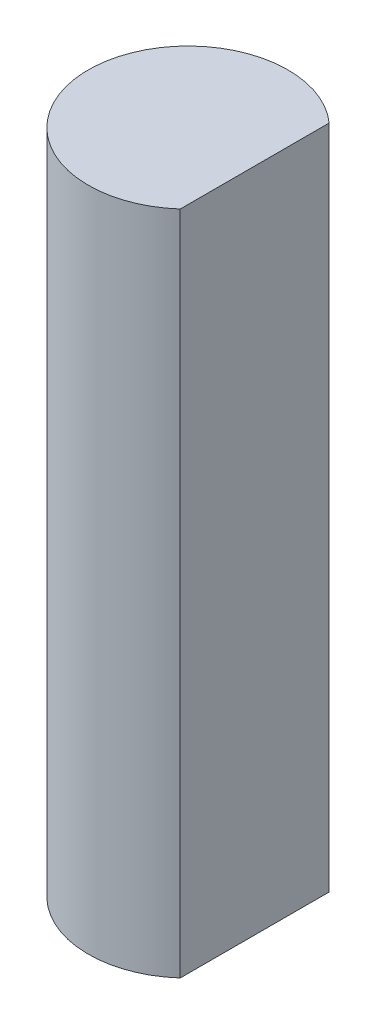
ISO-10303-21;
HEADER;
FILE_DESCRIPTION(('STEP AP214'),'2;1');
FILE_NAME('part.step','',(''),(''),'','','');
FILE_SCHEMA(('AUTOMOTIVE_DESIGN { 1 0 10303 214 1 1 1 1 }'));
ENDSEC;
DATA;
#1=APPLICATION_CONTEXT('core data for automotive mechanical design processes');
#2=APPLICATION_PROTOCOL_DEFINITION('international standard','automotive_design',2000,#1);
#3=PRODUCT_CONTEXT('',#1,'mechanical');
#4=PRODUCT('Part','Part','',(#3));
#5=PRODUCT_RELATED_PRODUCT_CATEGORY('part','',(#4));
#6=PRODUCT_DEFINITION_FORMATION('','',#4);
#7=PRODUCT_DEFINITION_CONTEXT('part definition',#1,'design');
#8=PRODUCT_DEFINITION('design','',#6,#7);
#9=PRODUCT_DEFINITION_SHAPE('','',#8);
#10=(LENGTH_UNIT() NAMED_UNIT(*) SI_UNIT(.MILLI.,.METRE.));
#11=(NAMED_UNIT(*) PLANE_ANGLE_UNIT() SI_UNIT($,.RADIAN.));
#12=(NAMED_UNIT(*) SI_UNIT($,.STERADIAN.) SOLID_ANGLE_UNIT());
#13=UNCERTAINTY_MEASURE_WITH_UNIT(LENGTH_MEASURE(1.E-05),#10,'distance_accuracy_value','');
#14=(GEOMETRIC_REPRESENTATION_CONTEXT(3) GLOBAL_UNCERTAINTY_ASSIGNED_CONTEXT((#13)) GLOBAL_UNIT_ASSIGNED_CONTEXT((#10,
#11,#12)) REPRESENTATION_CONTEXT('',''));
#15=CARTESIAN_POINT('',(0.,0.,0.));
#16=DIRECTION('',(0.,0.,1.));
#17=DIRECTION('',(1.,0.,0.));
#18=AXIS2_PLACEMENT_3D('',#15,#16,#17);
#19=CARTESIAN_POINT('',(1.,10.,0.));
#20=DIRECTION('',(1.,0.,0.));
#21=DIRECTION('',(0.,0.,-1.));
#22=AXIS2_PLACEMENT_3D('',#19,#20,#21);
#23=PLANE('',#22);
#24=DIRECTION('',(0.,0.,1.));
#25=VECTOR('',#24,1.);
#26=CARTESIAN_POINT('',(1.,0.,0.));
#27=LINE('',#26,#25);
#28=CARTESIAN_POINT('',(1.,0.,-1.11803398874989));
#29=VERTEX_POINT('',#28);
#30=CARTESIAN_POINT('',(1.,0.,1.11803398874989));
#31=VERTEX_POINT('',#30);
#32=EDGE_CURVE('E61',#29,#31,#27,.T.);
#33=ORIENTED_EDGE('',*,*,#32,.F.);
#34=DIRECTION('',(0.,-1.,0.));
#35=VECTOR('',#34,1.);
#36=CARTESIAN_POINT('',(1.,10.,-1.11803398874989));
#37=LINE('',#36,#35);
#38=CARTESIAN_POINT('',(1.,10.,-1.11803398874989));
#39=VERTEX_POINT('',#38);
#40=EDGE_CURVE('E11',#39,#29,#37,.T.);
#41=ORIENTED_EDGE('',*,*,#40,.F.);
#42=DIRECTION('',(0.,0.,1.));
#43=VECTOR('',#42,1.);
#44=CARTESIAN_POINT('',(1.,10.,0.));
#45=LINE('',#44,#43);
#46=CARTESIAN_POINT('',(1.,10.,1.11803398874989));
#47=VERTEX_POINT('',#46);
#48=EDGE_CURVE('E62',#39,#47,#45,.T.);
#49=ORIENTED_EDGE('',*,*,#48,.T.);
#50=DIRECTION('',(0.,-1.,0.));
#51=VECTOR('',#50,1.);
#52=CARTESIAN_POINT('',(1.,10.,1.11803398874989));
#53=LINE('',#52,#51);
#54=EDGE_CURVE('E41',#47,#31,#53,.T.);
#55=ORIENTED_EDGE('',*,*,#54,.T.);
#56=EDGE_LOOP('',(#33,#41,#49,#55));
#57=FACE_BOUND('',#56,.T.);
#58=ADVANCED_FACE('F33',(#57),#23,.T.);
#59=CARTESIAN_POINT('',(0.,10.,0.));
#60=DIRECTION('',(0.,-1.,0.));
#61=DIRECTION('',(0.,0.,-1.));
#62=AXIS2_PLACEMENT_3D('',#59,#60,#61);
#63=CYLINDRICAL_SURFACE('',#62,1.5);
#64=CARTESIAN_POINT('',(0.,0.,0.));
#65=DIRECTION('',(0.,1.,0.));
#66=DIRECTION('',(0.,0.,1.));
#67=AXIS2_PLACEMENT_3D('',#64,#65,#66);
#68=CIRCLE('',#67,1.5);
#69=EDGE_CURVE('E63',#29,#31,#68,.T.);
#70=ORIENTED_EDGE('',*,*,#69,.T.);
#71=ORIENTED_EDGE('',*,*,#54,.F.);
#72=CARTESIAN_POINT('',(0.,10.,0.));
#73=DIRECTION('',(0.,1.,0.));
#74=DIRECTION('',(0.,0.,1.));
#75=AXIS2_PLACEMENT_3D('',#72,#73,#74);
#76=CIRCLE('',#75,1.5);
#77=EDGE_CURVE('E48',#39,#47,#76,.T.);
#78=ORIENTED_EDGE('',*,*,#77,.F.);
#79=ORIENTED_EDGE('',*,*,#40,.T.);
#80=EDGE_LOOP('',(#70,#71,#78,#79));
#81=FACE_BOUND('',#80,.T.);
#82=ADVANCED_FACE('F64',(#81),#63,.T.);
#83=CARTESIAN_POINT('',(0.,10.,0.));
#84=DIRECTION('',(0.,1.,0.));
#85=DIRECTION('',(0.,0.,1.));
#86=AXIS2_PLACEMENT_3D('',#83,#84,#85);
#87=PLANE('',#86);
#88=ORIENTED_EDGE('',*,*,#48,.F.);
#89=ORIENTED_EDGE('',*,*,#77,.T.);
#90=EDGE_LOOP('',(#88,#89));
#91=FACE_BOUND('',#90,.T.);
#92=ADVANCED_FACE('F72',(#91),#87,.T.);
#93=CARTESIAN_POINT('',(0.,0.,0.));
#94=DIRECTION('',(0.,1.,0.));
#95=DIRECTION('',(0.,0.,1.));
#96=AXIS2_PLACEMENT_3D('',#93,#94,#95);
#97=PLANE('',#96);
#98=ORIENTED_EDGE('',*,*,#32,.T.);
#99=ORIENTED_EDGE('',*,*,#69,.F.);
#100=EDGE_LOOP('',(#98,#99));
#101=FACE_BOUND('',#100,.T.);
#102=ADVANCED_FACE('F67',(#101),#97,.F.);
#103=CLOSED_SHELL('',(#58,#82,#92,#102));
#104=MANIFOLD_SOLID_BREP('B2',#103);
#105=ADVANCED_BREP_SHAPE_REPRESENTATION('',(#18,#104),#14);
#106=SHAPE_DEFINITION_REPRESENTATION(#9,#105);
ENDSEC;
END-ISO-10303-21;
